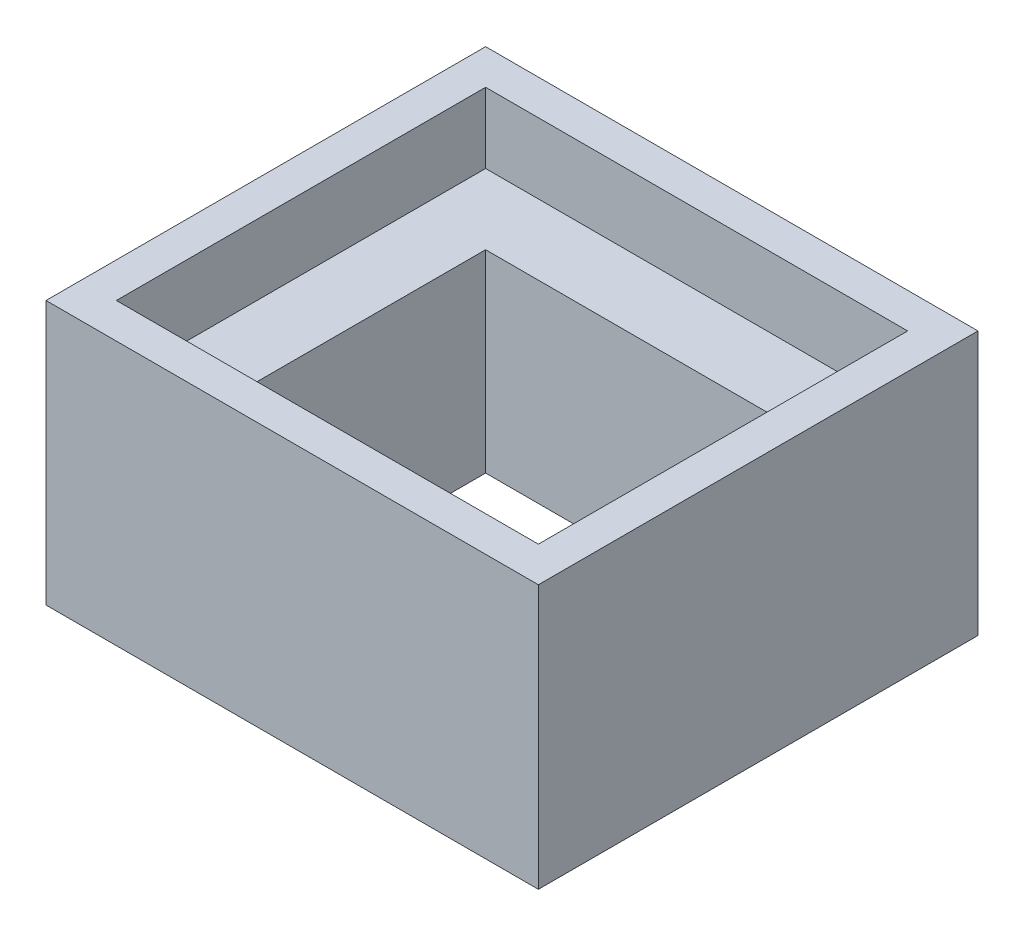
ISO-10303-21;
HEADER;
FILE_DESCRIPTION(('STEP AP214'),'2;1');
FILE_NAME('part.step','',(''),(''),'','','');
FILE_SCHEMA(('AUTOMOTIVE_DESIGN { 1 0 10303 214 1 1 1 1 }'));
ENDSEC;
DATA;
#1=APPLICATION_CONTEXT('core data for automotive mechanical design processes');
#2=APPLICATION_PROTOCOL_DEFINITION('international standard','automotive_design',2000,#1);
#3=PRODUCT_CONTEXT('',#1,'mechanical');
#4=PRODUCT('Part','Part','',(#3));
#5=PRODUCT_RELATED_PRODUCT_CATEGORY('part','',(#4));
#6=PRODUCT_DEFINITION_FORMATION('','',#4);
#7=PRODUCT_DEFINITION_CONTEXT('part definition',#1,'design');
#8=PRODUCT_DEFINITION('design','',#6,#7);
#9=PRODUCT_DEFINITION_SHAPE('','',#8);
#10=(LENGTH_UNIT() NAMED_UNIT(*) SI_UNIT(.MILLI.,.METRE.));
#11=(NAMED_UNIT(*) PLANE_ANGLE_UNIT() SI_UNIT($,.RADIAN.));
#12=(NAMED_UNIT(*) SI_UNIT($,.STERADIAN.) SOLID_ANGLE_UNIT());
#13=UNCERTAINTY_MEASURE_WITH_UNIT(LENGTH_MEASURE(1.E-05),#10,'distance_accuracy_value','');
#14=(GEOMETRIC_REPRESENTATION_CONTEXT(3) GLOBAL_UNCERTAINTY_ASSIGNED_CONTEXT((#13)) GLOBAL_UNIT_ASSIGNED_CONTEXT((#10,
#11,#12)) REPRESENTATION_CONTEXT('',''));
#15=CARTESIAN_POINT('',(0.,0.,0.));
#16=DIRECTION('',(0.,0.,1.));
#17=DIRECTION('',(1.,0.,0.));
#18=AXIS2_PLACEMENT_3D('',#15,#16,#17);
#19=CARTESIAN_POINT('',(28.,30.,25.));
#20=DIRECTION('',(-1.,0.,0.));
#21=DIRECTION('',(0.,0.,1.));
#22=AXIS2_PLACEMENT_3D('',#19,#20,#21);
#23=PLANE('',#22);
#24=DIRECTION('',(0.,0.,-1.));
#25=VECTOR('',#24,1.);
#26=CARTESIAN_POINT('',(28.,0.,25.));
#27=LINE('',#26,#25);
#28=CARTESIAN_POINT('',(28.,0.,25.));
#29=VERTEX_POINT('',#28);
#30=CARTESIAN_POINT('',(28.,0.,-25.));
#31=VERTEX_POINT('',#30);
#32=EDGE_CURVE('E182',#29,#31,#27,.T.);
#33=ORIENTED_EDGE('',*,*,#32,.T.);
#34=DIRECTION('',(0.,-1.,0.));
#35=VECTOR('',#34,1.);
#36=CARTESIAN_POINT('',(28.,30.,-25.));
#37=LINE('',#36,#35);
#38=CARTESIAN_POINT('',(28.,30.,-25.));
#39=VERTEX_POINT('',#38);
#40=EDGE_CURVE('E215',#39,#31,#37,.T.);
#41=ORIENTED_EDGE('',*,*,#40,.F.);
#42=DIRECTION('',(0.,0.,-1.));
#43=VECTOR('',#42,1.);
#44=CARTESIAN_POINT('',(28.,30.,25.));
#45=LINE('',#44,#43);
#46=CARTESIAN_POINT('',(28.,30.,25.));
#47=VERTEX_POINT('',#46);
#48=EDGE_CURVE('E189',#47,#39,#45,.T.);
#49=ORIENTED_EDGE('',*,*,#48,.F.);
#50=DIRECTION('',(0.,-1.,0.));
#51=VECTOR('',#50,1.);
#52=CARTESIAN_POINT('',(28.,30.,25.));
#53=LINE('',#52,#51);
#54=EDGE_CURVE('E199',#47,#29,#53,.T.);
#55=ORIENTED_EDGE('',*,*,#54,.T.);
#56=EDGE_LOOP('',(#33,#41,#49,#55));
#57=FACE_BOUND('',#56,.T.);
#58=ADVANCED_FACE('F41',(#57),#23,.F.);
#59=CARTESIAN_POINT('',(-28.,30.,-25.));
#60=DIRECTION('',(0.,0.,1.));
#61=DIRECTION('',(1.,0.,0.));
#62=AXIS2_PLACEMENT_3D('',#59,#60,#61);
#63=PLANE('',#62);
#64=DIRECTION('',(-1.,0.,0.));
#65=VECTOR('',#64,1.);
#66=CARTESIAN_POINT('',(-28.,0.,-25.));
#67=LINE('',#66,#65);
#68=CARTESIAN_POINT('',(-28.,0.,-25.));
#69=VERTEX_POINT('',#68);
#70=EDGE_CURVE('E202',#31,#69,#67,.T.);
#71=ORIENTED_EDGE('',*,*,#70,.T.);
#72=DIRECTION('',(0.,-1.,0.));
#73=VECTOR('',#72,1.);
#74=CARTESIAN_POINT('',(-28.,30.,-25.));
#75=LINE('',#74,#73);
#76=CARTESIAN_POINT('',(-28.,30.,-25.));
#77=VERTEX_POINT('',#76);
#78=EDGE_CURVE('E212',#77,#69,#75,.T.);
#79=ORIENTED_EDGE('',*,*,#78,.F.);
#80=DIRECTION('',(-1.,0.,0.));
#81=VECTOR('',#80,1.);
#82=CARTESIAN_POINT('',(-28.,30.,-25.));
#83=LINE('',#82,#81);
#84=EDGE_CURVE('E192',#39,#77,#83,.T.);
#85=ORIENTED_EDGE('',*,*,#84,.F.);
#86=ORIENTED_EDGE('',*,*,#40,.T.);
#87=EDGE_LOOP('',(#71,#79,#85,#86));
#88=FACE_BOUND('',#87,.T.);
#89=ADVANCED_FACE('F238',(#88),#63,.F.);
#90=CARTESIAN_POINT('',(-28.,30.,25.));
#91=DIRECTION('',(1.,0.,0.));
#92=DIRECTION('',(0.,0.,-1.));
#93=AXIS2_PLACEMENT_3D('',#90,#91,#92);
#94=PLANE('',#93);
#95=DIRECTION('',(0.,0.,1.));
#96=VECTOR('',#95,1.);
#97=CARTESIAN_POINT('',(-28.,0.,25.));
#98=LINE('',#97,#96);
#99=CARTESIAN_POINT('',(-28.,0.,25.));
#100=VERTEX_POINT('',#99);
#101=EDGE_CURVE('E204',#69,#100,#98,.T.);
#102=ORIENTED_EDGE('',*,*,#101,.T.);
#103=DIRECTION('',(0.,-1.,0.));
#104=VECTOR('',#103,1.);
#105=CARTESIAN_POINT('',(-28.,30.,25.));
#106=LINE('',#105,#104);
#107=CARTESIAN_POINT('',(-28.,30.,25.));
#108=VERTEX_POINT('',#107);
#109=EDGE_CURVE('E209',#108,#100,#106,.T.);
#110=ORIENTED_EDGE('',*,*,#109,.F.);
#111=DIRECTION('',(0.,0.,1.));
#112=VECTOR('',#111,1.);
#113=CARTESIAN_POINT('',(-28.,30.,25.));
#114=LINE('',#113,#112);
#115=EDGE_CURVE('E195',#77,#108,#114,.T.);
#116=ORIENTED_EDGE('',*,*,#115,.F.);
#117=ORIENTED_EDGE('',*,*,#78,.T.);
#118=EDGE_LOOP('',(#102,#110,#116,#117));
#119=FACE_BOUND('',#118,.T.);
#120=ADVANCED_FACE('F243',(#119),#94,.F.);
#121=CARTESIAN_POINT('',(-28.,30.,25.));
#122=DIRECTION('',(0.,0.,-1.));
#123=DIRECTION('',(-1.,0.,0.));
#124=AXIS2_PLACEMENT_3D('',#121,#122,#123);
#125=PLANE('',#124);
#126=DIRECTION('',(1.,0.,0.));
#127=VECTOR('',#126,1.);
#128=CARTESIAN_POINT('',(-28.,0.,25.));
#129=LINE('',#128,#127);
#130=EDGE_CURVE('E193',#100,#29,#129,.T.);
#131=ORIENTED_EDGE('',*,*,#130,.T.);
#132=ORIENTED_EDGE('',*,*,#54,.F.);
#133=DIRECTION('',(1.,0.,0.));
#134=VECTOR('',#133,1.);
#135=CARTESIAN_POINT('',(-28.,30.,25.));
#136=LINE('',#135,#134);
#137=EDGE_CURVE('E197',#108,#47,#136,.T.);
#138=ORIENTED_EDGE('',*,*,#137,.F.);
#139=ORIENTED_EDGE('',*,*,#109,.T.);
#140=EDGE_LOOP('',(#131,#132,#138,#139));
#141=FACE_BOUND('',#140,.T.);
#142=ADVANCED_FACE('F258',(#141),#125,.F.);
#143=CARTESIAN_POINT('',(0.,30.,0.));
#144=DIRECTION('',(0.,-1.,0.));
#145=DIRECTION('',(0.,0.,-1.));
#146=AXIS2_PLACEMENT_3D('',#143,#144,#145);
#147=PLANE('',#146);
#148=DIRECTION('',(-1.,0.,0.));
#149=VECTOR('',#148,1.);
#150=CARTESIAN_POINT('',(-24.,30.,-21.));
#151=LINE('',#150,#149);
#152=CARTESIAN_POINT('',(24.,30.,-21.));
#153=VERTEX_POINT('',#152);
#154=CARTESIAN_POINT('',(-24.,30.,-21.));
#155=VERTEX_POINT('',#154);
#156=EDGE_CURVE('E172',#153,#155,#151,.T.);
#157=ORIENTED_EDGE('',*,*,#156,.F.);
#158=DIRECTION('',(0.,0.,-1.));
#159=VECTOR('',#158,1.);
#160=CARTESIAN_POINT('',(24.,30.,21.));
#161=LINE('',#160,#159);
#162=CARTESIAN_POINT('',(24.,30.,21.));
#163=VERTEX_POINT('',#162);
#164=EDGE_CURVE('E152',#163,#153,#161,.T.);
#165=ORIENTED_EDGE('',*,*,#164,.F.);
#166=DIRECTION('',(1.,0.,0.));
#167=VECTOR('',#166,1.);
#168=CARTESIAN_POINT('',(-24.,30.,21.));
#169=LINE('',#168,#167);
#170=CARTESIAN_POINT('',(-24.,30.,21.));
#171=VERTEX_POINT('',#170);
#172=EDGE_CURVE('E161',#171,#163,#169,.T.);
#173=ORIENTED_EDGE('',*,*,#172,.F.);
#174=DIRECTION('',(0.,0.,1.));
#175=VECTOR('',#174,1.);
#176=CARTESIAN_POINT('',(-24.,30.,21.));
#177=LINE('',#176,#175);
#178=EDGE_CURVE('E175',#155,#171,#177,.T.);
#179=ORIENTED_EDGE('',*,*,#178,.F.);
#180=EDGE_LOOP('',(#157,#165,#173,#179));
#181=FACE_BOUND('',#180,.T.);
#182=ORIENTED_EDGE('',*,*,#48,.T.);
#183=ORIENTED_EDGE('',*,*,#84,.T.);
#184=ORIENTED_EDGE('',*,*,#115,.T.);
#185=ORIENTED_EDGE('',*,*,#137,.T.);
#186=EDGE_LOOP('',(#182,#183,#184,#185));
#187=FACE_BOUND('',#186,.T.);
#188=ADVANCED_FACE('F254',(#181,#187),#147,.F.);
#189=CARTESIAN_POINT('',(0.,0.,0.));
#190=DIRECTION('',(0.,-1.,0.));
#191=DIRECTION('',(0.,0.,-1.));
#192=AXIS2_PLACEMENT_3D('',#189,#190,#191);
#193=PLANE('',#192);
#194=DIRECTION('',(0.,0.,-1.));
#195=VECTOR('',#194,1.);
#196=CARTESIAN_POINT('',(16.,0.,13.));
#197=LINE('',#196,#195);
#198=CARTESIAN_POINT('',(16.,0.,13.));
#199=VERTEX_POINT('',#198);
#200=CARTESIAN_POINT('',(16.,0.,-13.));
#201=VERTEX_POINT('',#200);
#202=EDGE_CURVE('E132',#199,#201,#197,.T.);
#203=ORIENTED_EDGE('',*,*,#202,.T.);
#204=DIRECTION('',(-1.,0.,0.));
#205=VECTOR('',#204,1.);
#206=CARTESIAN_POINT('',(-16.,0.,-13.));
#207=LINE('',#206,#205);
#208=CARTESIAN_POINT('',(-16.,0.,-13.));
#209=VERTEX_POINT('',#208);
#210=EDGE_CURVE('E139',#201,#209,#207,.T.);
#211=ORIENTED_EDGE('',*,*,#210,.T.);
#212=DIRECTION('',(0.,0.,1.));
#213=VECTOR('',#212,1.);
#214=CARTESIAN_POINT('',(-16.,0.,13.));
#215=LINE('',#214,#213);
#216=CARTESIAN_POINT('',(-16.,0.,13.));
#217=VERTEX_POINT('',#216);
#218=EDGE_CURVE('E55',#209,#217,#215,.T.);
#219=ORIENTED_EDGE('',*,*,#218,.T.);
#220=DIRECTION('',(1.,0.,0.));
#221=VECTOR('',#220,1.);
#222=CARTESIAN_POINT('',(-16.,0.,13.));
#223=LINE('',#222,#221);
#224=EDGE_CURVE('E136',#217,#199,#223,.T.);
#225=ORIENTED_EDGE('',*,*,#224,.T.);
#226=EDGE_LOOP('',(#203,#211,#219,#225));
#227=FACE_BOUND('',#226,.T.);
#228=ORIENTED_EDGE('',*,*,#32,.F.);
#229=ORIENTED_EDGE('',*,*,#130,.F.);
#230=ORIENTED_EDGE('',*,*,#101,.F.);
#231=ORIENTED_EDGE('',*,*,#70,.F.);
#232=EDGE_LOOP('',(#228,#229,#230,#231));
#233=FACE_BOUND('',#232,.T.);
#234=ADVANCED_FACE('F143',(#227,#233),#193,.T.);
#235=CARTESIAN_POINT('',(24.,22.,21.));
#236=DIRECTION('',(1.,0.,0.));
#237=DIRECTION('',(0.,0.,-1.));
#238=AXIS2_PLACEMENT_3D('',#235,#236,#237);
#239=PLANE('',#238);
#240=ORIENTED_EDGE('',*,*,#164,.T.);
#241=DIRECTION('',(0.,1.,0.));
#242=VECTOR('',#241,1.);
#243=CARTESIAN_POINT('',(24.,22.,-21.));
#244=LINE('',#243,#242);
#245=CARTESIAN_POINT('',(24.,22.,-21.));
#246=VERTEX_POINT('',#245);
#247=EDGE_CURVE('E170',#246,#153,#244,.T.);
#248=ORIENTED_EDGE('',*,*,#247,.F.);
#249=DIRECTION('',(0.,0.,-1.));
#250=VECTOR('',#249,1.);
#251=CARTESIAN_POINT('',(24.,22.,21.));
#252=LINE('',#251,#250);
#253=CARTESIAN_POINT('',(24.,22.,21.));
#254=VERTEX_POINT('',#253);
#255=EDGE_CURVE('E157',#254,#246,#252,.T.);
#256=ORIENTED_EDGE('',*,*,#255,.F.);
#257=DIRECTION('',(0.,1.,0.));
#258=VECTOR('',#257,1.);
#259=CARTESIAN_POINT('',(24.,22.,21.));
#260=LINE('',#259,#258);
#261=EDGE_CURVE('E180',#254,#163,#260,.T.);
#262=ORIENTED_EDGE('',*,*,#261,.T.);
#263=EDGE_LOOP('',(#240,#248,#256,#262));
#264=FACE_BOUND('',#263,.T.);
#265=ADVANCED_FACE('F269',(#264),#239,.F.);
#266=CARTESIAN_POINT('',(-24.,22.,21.));
#267=DIRECTION('',(0.,0.,1.));
#268=DIRECTION('',(1.,0.,0.));
#269=AXIS2_PLACEMENT_3D('',#266,#267,#268);
#270=PLANE('',#269);
#271=ORIENTED_EDGE('',*,*,#172,.T.);
#272=ORIENTED_EDGE('',*,*,#261,.F.);
#273=DIRECTION('',(1.,0.,0.));
#274=VECTOR('',#273,1.);
#275=CARTESIAN_POINT('',(-24.,22.,21.));
#276=LINE('',#275,#274);
#277=CARTESIAN_POINT('',(-24.,22.,21.));
#278=VERTEX_POINT('',#277);
#279=EDGE_CURVE('E167',#278,#254,#276,.T.);
#280=ORIENTED_EDGE('',*,*,#279,.F.);
#281=DIRECTION('',(0.,1.,0.));
#282=VECTOR('',#281,1.);
#283=CARTESIAN_POINT('',(-24.,22.,21.));
#284=LINE('',#283,#282);
#285=EDGE_CURVE('E183',#278,#171,#284,.T.);
#286=ORIENTED_EDGE('',*,*,#285,.T.);
#287=EDGE_LOOP('',(#271,#272,#280,#286));
#288=FACE_BOUND('',#287,.T.);
#289=ADVANCED_FACE('F275',(#288),#270,.F.);
#290=CARTESIAN_POINT('',(-24.,22.,21.));
#291=DIRECTION('',(-1.,0.,0.));
#292=DIRECTION('',(0.,0.,1.));
#293=AXIS2_PLACEMENT_3D('',#290,#291,#292);
#294=PLANE('',#293);
#295=ORIENTED_EDGE('',*,*,#178,.T.);
#296=ORIENTED_EDGE('',*,*,#285,.F.);
#297=DIRECTION('',(0.,0.,1.));
#298=VECTOR('',#297,1.);
#299=CARTESIAN_POINT('',(-24.,22.,21.));
#300=LINE('',#299,#298);
#301=CARTESIAN_POINT('',(-24.,22.,-21.));
#302=VERTEX_POINT('',#301);
#303=EDGE_CURVE('E164',#302,#278,#300,.T.);
#304=ORIENTED_EDGE('',*,*,#303,.F.);
#305=DIRECTION('',(0.,1.,0.));
#306=VECTOR('',#305,1.);
#307=CARTESIAN_POINT('',(-24.,22.,-21.));
#308=LINE('',#307,#306);
#309=EDGE_CURVE('E185',#302,#155,#308,.T.);
#310=ORIENTED_EDGE('',*,*,#309,.T.);
#311=EDGE_LOOP('',(#295,#296,#304,#310));
#312=FACE_BOUND('',#311,.T.);
#313=ADVANCED_FACE('F280',(#312),#294,.F.);
#314=CARTESIAN_POINT('',(-24.,22.,-21.));
#315=DIRECTION('',(0.,0.,-1.));
#316=DIRECTION('',(-1.,0.,0.));
#317=AXIS2_PLACEMENT_3D('',#314,#315,#316);
#318=PLANE('',#317);
#319=ORIENTED_EDGE('',*,*,#156,.T.);
#320=ORIENTED_EDGE('',*,*,#309,.F.);
#321=DIRECTION('',(-1.,0.,0.));
#322=VECTOR('',#321,1.);
#323=CARTESIAN_POINT('',(-24.,22.,-21.));
#324=LINE('',#323,#322);
#325=EDGE_CURVE('E160',#246,#302,#324,.T.);
#326=ORIENTED_EDGE('',*,*,#325,.F.);
#327=ORIENTED_EDGE('',*,*,#247,.T.);
#328=EDGE_LOOP('',(#319,#320,#326,#327));
#329=FACE_BOUND('',#328,.T.);
#330=ADVANCED_FACE('F277',(#329),#318,.F.);
#331=CARTESIAN_POINT('',(0.,22.,0.));
#332=DIRECTION('',(0.,-1.,0.));
#333=DIRECTION('',(0.,0.,-1.));
#334=AXIS2_PLACEMENT_3D('',#331,#332,#333);
#335=PLANE('',#334);
#336=DIRECTION('',(1.,0.,0.));
#337=VECTOR('',#336,1.);
#338=CARTESIAN_POINT('',(0.,22.,-13.));
#339=LINE('',#338,#337);
#340=CARTESIAN_POINT('',(-16.,22.,-13.));
#341=VERTEX_POINT('',#340);
#342=CARTESIAN_POINT('',(16.,22.,-13.));
#343=VERTEX_POINT('',#342);
#344=EDGE_CURVE('E218',#341,#343,#339,.T.);
#345=ORIENTED_EDGE('',*,*,#344,.T.);
#346=DIRECTION('',(0.,0.,1.));
#347=VECTOR('',#346,1.);
#348=CARTESIAN_POINT('',(16.,22.,0.));
#349=LINE('',#348,#347);
#350=CARTESIAN_POINT('',(16.,22.,13.));
#351=VERTEX_POINT('',#350);
#352=EDGE_CURVE('E11',#343,#351,#349,.T.);
#353=ORIENTED_EDGE('',*,*,#352,.T.);
#354=DIRECTION('',(-1.,0.,0.));
#355=VECTOR('',#354,1.);
#356=CARTESIAN_POINT('',(0.,22.,13.));
#357=LINE('',#356,#355);
#358=CARTESIAN_POINT('',(-16.,22.,13.));
#359=VERTEX_POINT('',#358);
#360=EDGE_CURVE('E48',#351,#359,#357,.T.);
#361=ORIENTED_EDGE('',*,*,#360,.T.);
#362=DIRECTION('',(0.,0.,-1.));
#363=VECTOR('',#362,1.);
#364=CARTESIAN_POINT('',(-16.,22.,0.));
#365=LINE('',#364,#363);
#366=EDGE_CURVE('E220',#359,#341,#365,.T.);
#367=ORIENTED_EDGE('',*,*,#366,.T.);
#368=EDGE_LOOP('',(#345,#353,#361,#367));
#369=FACE_BOUND('',#368,.T.);
#370=ORIENTED_EDGE('',*,*,#255,.T.);
#371=ORIENTED_EDGE('',*,*,#325,.T.);
#372=ORIENTED_EDGE('',*,*,#303,.T.);
#373=ORIENTED_EDGE('',*,*,#279,.T.);
#374=EDGE_LOOP('',(#370,#371,#372,#373));
#375=FACE_BOUND('',#374,.T.);
#376=ADVANCED_FACE('F224',(#369,#375),#335,.F.);
#377=CARTESIAN_POINT('',(16.,0.,13.));
#378=DIRECTION('',(1.,0.,0.));
#379=DIRECTION('',(0.,0.,-1.));
#380=AXIS2_PLACEMENT_3D('',#377,#378,#379);
#381=PLANE('',#380);
#382=DIRECTION('',(0.,1.,0.));
#383=VECTOR('',#382,1.);
#384=CARTESIAN_POINT('',(16.,0.,-13.));
#385=LINE('',#384,#383);
#386=EDGE_CURVE('E63',#201,#343,#385,.T.);
#387=ORIENTED_EDGE('',*,*,#386,.F.);
#388=ORIENTED_EDGE('',*,*,#202,.F.);
#389=DIRECTION('',(0.,1.,0.));
#390=VECTOR('',#389,1.);
#391=CARTESIAN_POINT('',(16.,0.,13.));
#392=LINE('',#391,#390);
#393=EDGE_CURVE('E150',#199,#351,#392,.T.);
#394=ORIENTED_EDGE('',*,*,#393,.T.);
#395=ORIENTED_EDGE('',*,*,#352,.F.);
#396=EDGE_LOOP('',(#387,#388,#394,#395));
#397=FACE_BOUND('',#396,.T.);
#398=ADVANCED_FACE('F129',(#397),#381,.F.);
#399=CARTESIAN_POINT('',(-16.,0.,13.));
#400=DIRECTION('',(0.,0.,1.));
#401=DIRECTION('',(1.,0.,0.));
#402=AXIS2_PLACEMENT_3D('',#399,#400,#401);
#403=PLANE('',#402);
#404=ORIENTED_EDGE('',*,*,#393,.F.);
#405=ORIENTED_EDGE('',*,*,#224,.F.);
#406=DIRECTION('',(0.,1.,0.));
#407=VECTOR('',#406,1.);
#408=CARTESIAN_POINT('',(-16.,0.,13.));
#409=LINE('',#408,#407);
#410=EDGE_CURVE('E153',#217,#359,#409,.T.);
#411=ORIENTED_EDGE('',*,*,#410,.T.);
#412=ORIENTED_EDGE('',*,*,#360,.F.);
#413=EDGE_LOOP('',(#404,#405,#411,#412));
#414=FACE_BOUND('',#413,.T.);
#415=ADVANCED_FACE('F227',(#414),#403,.F.);
#416=CARTESIAN_POINT('',(-16.,0.,13.));
#417=DIRECTION('',(-1.,0.,0.));
#418=DIRECTION('',(0.,0.,1.));
#419=AXIS2_PLACEMENT_3D('',#416,#417,#418);
#420=PLANE('',#419);
#421=ORIENTED_EDGE('',*,*,#410,.F.);
#422=ORIENTED_EDGE('',*,*,#218,.F.);
#423=DIRECTION('',(0.,1.,0.));
#424=VECTOR('',#423,1.);
#425=CARTESIAN_POINT('',(-16.,0.,-13.));
#426=LINE('',#425,#424);
#427=EDGE_CURVE('E135',#209,#341,#426,.T.);
#428=ORIENTED_EDGE('',*,*,#427,.T.);
#429=ORIENTED_EDGE('',*,*,#366,.F.);
#430=EDGE_LOOP('',(#421,#422,#428,#429));
#431=FACE_BOUND('',#430,.T.);
#432=ADVANCED_FACE('F228',(#431),#420,.F.);
#433=CARTESIAN_POINT('',(-16.,0.,-13.));
#434=DIRECTION('',(0.,0.,-1.));
#435=DIRECTION('',(-1.,0.,0.));
#436=AXIS2_PLACEMENT_3D('',#433,#434,#435);
#437=PLANE('',#436);
#438=ORIENTED_EDGE('',*,*,#427,.F.);
#439=ORIENTED_EDGE('',*,*,#210,.F.);
#440=ORIENTED_EDGE('',*,*,#386,.T.);
#441=ORIENTED_EDGE('',*,*,#344,.F.);
#442=EDGE_LOOP('',(#438,#439,#440,#441));
#443=FACE_BOUND('',#442,.T.);
#444=ADVANCED_FACE('F140',(#443),#437,.F.);
#445=CLOSED_SHELL('',(#58,#89,#120,#142,#188,#234,#265,#289,#313,#330,#376,#398,#415,#432,#444));
#446=MANIFOLD_SOLID_BREP('B2',#445);
#447=ADVANCED_BREP_SHAPE_REPRESENTATION('',(#18,#446),#14);
#448=SHAPE_DEFINITION_REPRESENTATION(#9,#447);
ENDSEC;
END-ISO-10303-21;
